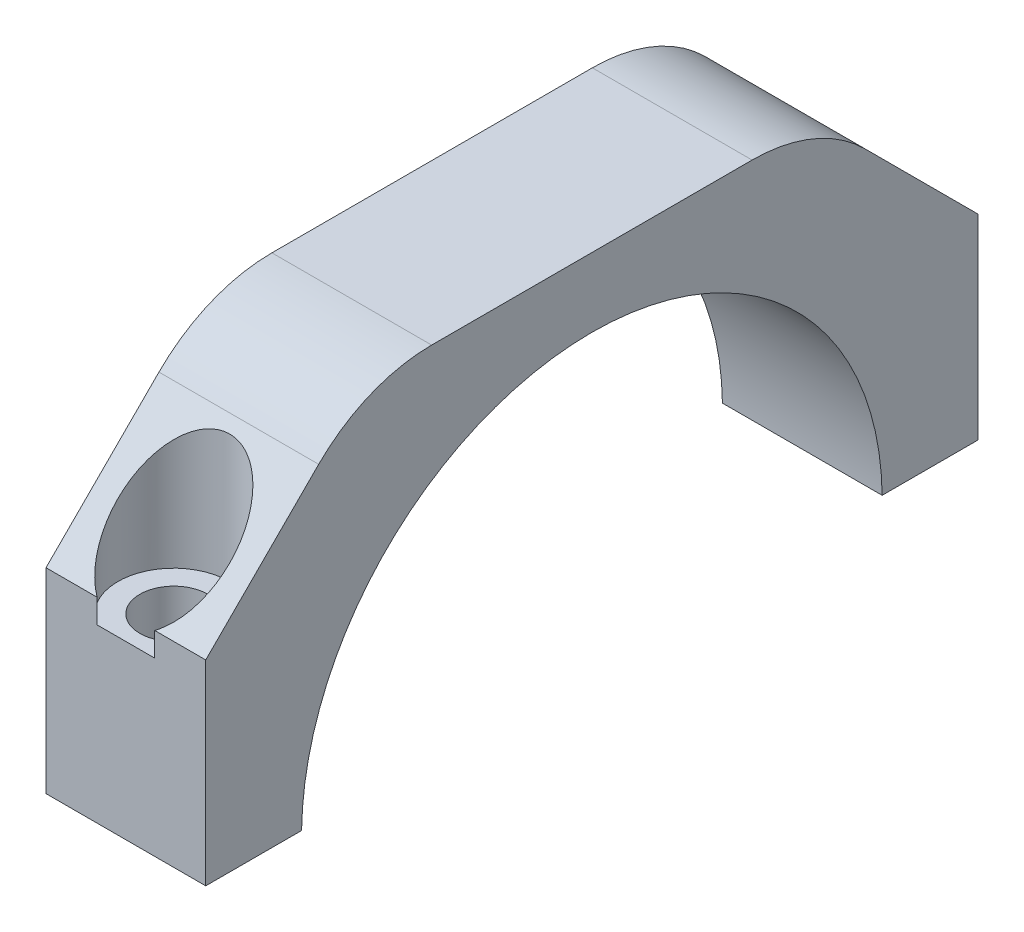
ISO-10303-21;
HEADER;
FILE_DESCRIPTION(('STEP AP214'),'2;1');
FILE_NAME('part.step','',(''),(''),'','','');
FILE_SCHEMA(('AUTOMOTIVE_DESIGN { 1 0 10303 214 1 1 1 1 }'));
ENDSEC;
DATA;
#1=APPLICATION_CONTEXT('core data for automotive mechanical design processes');
#2=APPLICATION_PROTOCOL_DEFINITION('international standard','automotive_design',2000,#1);
#3=PRODUCT_CONTEXT('',#1,'mechanical');
#4=PRODUCT('Part','Part','',(#3));
#5=PRODUCT_RELATED_PRODUCT_CATEGORY('part','',(#4));
#6=PRODUCT_DEFINITION_FORMATION('','',#4);
#7=PRODUCT_DEFINITION_CONTEXT('part definition',#1,'design');
#8=PRODUCT_DEFINITION('design','',#6,#7);
#9=PRODUCT_DEFINITION_SHAPE('','',#8);
#10=(LENGTH_UNIT() NAMED_UNIT(*) SI_UNIT(.MILLI.,.METRE.));
#11=(NAMED_UNIT(*) PLANE_ANGLE_UNIT() SI_UNIT($,.RADIAN.));
#12=(NAMED_UNIT(*) SI_UNIT($,.STERADIAN.) SOLID_ANGLE_UNIT());
#13=UNCERTAINTY_MEASURE_WITH_UNIT(LENGTH_MEASURE(1.E-05),#10,'distance_accuracy_value','');
#14=(GEOMETRIC_REPRESENTATION_CONTEXT(3) GLOBAL_UNCERTAINTY_ASSIGNED_CONTEXT((#13)) GLOBAL_UNIT_ASSIGNED_CONTEXT((#10,
#11,#12)) REPRESENTATION_CONTEXT('',''));
#15=CARTESIAN_POINT('',(0.,0.,0.));
#16=DIRECTION('',(0.,0.,1.));
#17=DIRECTION('',(1.,0.,0.));
#18=AXIS2_PLACEMENT_3D('',#15,#16,#17);
#19=CARTESIAN_POINT('',(10.,-44.5000000000001,-42.3465610477801));
#20=DIRECTION('',(0.,-1.,0.));
#21=DIRECTION('',(0.,0.,-1.));
#22=AXIS2_PLACEMENT_3D('',#19,#20,#21);
#23=CYLINDRICAL_SURFACE('',#22,4.24999999999999);
#24=CARTESIAN_POINT('',(10.,-44.5000000000001,-42.3465610477801));
#25=DIRECTION('',(0.,-1.,0.));
#26=DIRECTION('',(0.,0.,-1.));
#27=AXIS2_PLACEMENT_3D('',#24,#25,#26);
#28=CIRCLE('',#27,4.24999999999999);
#29=CARTESIAN_POINT('',(10.,-44.5000000000001,-46.59656104778));
#30=VERTEX_POINT('',#29);
#31=EDGE_CURVE('E199',#30,#30,#28,.T.);
#32=ORIENTED_EDGE('',*,*,#31,.T.);
#33=EDGE_LOOP('',(#32));
#34=FACE_BOUND('',#33,.T.);
#35=CARTESIAN_POINT('',(10.,-23.,-42.3465610477801));
#36=DIRECTION('',(0.,1.,0.));
#37=DIRECTION('',(0.,0.,1.));
#38=AXIS2_PLACEMENT_3D('',#35,#36,#37);
#39=CIRCLE('',#38,4.24999999999999);
#40=CARTESIAN_POINT('',(10.,-23.,-38.0965610477801));
#41=VERTEX_POINT('',#40);
#42=EDGE_CURVE('E173',#41,#41,#39,.F.);
#43=ORIENTED_EDGE('',*,*,#42,.F.);
#44=EDGE_LOOP('',(#43));
#45=FACE_BOUND('',#44,.T.);
#46=ADVANCED_FACE('F44',(#34,#45),#23,.F.);
#47=CARTESIAN_POINT('',(10.,-44.5,42.3465610477801));
#48=DIRECTION('',(0.,-1.,0.));
#49=DIRECTION('',(0.,0.,-1.));
#50=AXIS2_PLACEMENT_3D('',#47,#48,#49);
#51=CYLINDRICAL_SURFACE('',#50,4.24999999999999);
#52=CARTESIAN_POINT('',(10.,-44.5,42.3465610477801));
#53=DIRECTION('',(0.,-1.,0.));
#54=DIRECTION('',(0.,0.,-1.));
#55=AXIS2_PLACEMENT_3D('',#52,#53,#54);
#56=CIRCLE('',#55,4.24999999999999);
#57=CARTESIAN_POINT('',(10.,-44.5,38.0965610477801));
#58=VERTEX_POINT('',#57);
#59=EDGE_CURVE('E196',#58,#58,#56,.T.);
#60=ORIENTED_EDGE('',*,*,#59,.T.);
#61=EDGE_LOOP('',(#60));
#62=FACE_BOUND('',#61,.T.);
#63=CARTESIAN_POINT('',(10.,-23.,42.3465610477801));
#64=DIRECTION('',(0.,1.,0.));
#65=DIRECTION('',(0.,0.,1.));
#66=AXIS2_PLACEMENT_3D('',#63,#64,#65);
#67=CIRCLE('',#66,4.24999999999999);
#68=CARTESIAN_POINT('',(10.,-23.,46.59656104778));
#69=VERTEX_POINT('',#68);
#70=EDGE_CURVE('E187',#69,#69,#67,.F.);
#71=ORIENTED_EDGE('',*,*,#70,.F.);
#72=EDGE_LOOP('',(#71));
#73=FACE_BOUND('',#72,.T.);
#74=ADVANCED_FACE('F344',(#62,#73),#51,.F.);
#75=CARTESIAN_POINT('',(20.,0.,48.3465610477801));
#76=DIRECTION('',(0.,0.,-1.));
#77=DIRECTION('',(0.,1.,0.));
#78=AXIS2_PLACEMENT_3D('',#75,#76,#77);
#79=PLANE('',#78);
#80=DIRECTION('',(1.,0.,0.));
#81=VECTOR('',#80,1.);
#82=CARTESIAN_POINT('',(20.,-23.,48.3465610477801));
#83=LINE('',#82,#81);
#84=CARTESIAN_POINT('',(6.394448724536,-23.,48.3465610477801));
#85=VERTEX_POINT('',#84);
#86=CARTESIAN_POINT('',(13.605551275464,-23.,48.3465610477801));
#87=VERTEX_POINT('',#86);
#88=EDGE_CURVE('E188',#85,#87,#83,.T.);
#89=ORIENTED_EDGE('',*,*,#88,.F.);
#90=DIRECTION('',(0.,1.,0.));
#91=VECTOR('',#90,1.);
#92=CARTESIAN_POINT('',(6.394448724536,-23.,48.3465610477801));
#93=LINE('',#92,#91);
#94=CARTESIAN_POINT('',(6.394448724536,-20.,48.3465610477801));
#95=VERTEX_POINT('',#94);
#96=EDGE_CURVE('E193',#85,#95,#93,.T.);
#97=ORIENTED_EDGE('',*,*,#96,.T.);
#98=DIRECTION('',(-1.,0.,0.));
#99=VECTOR('',#98,1.);
#100=CARTESIAN_POINT('',(20.,-20.,48.3465610477801));
#101=LINE('',#100,#99);
#102=CARTESIAN_POINT('',(0.,-20.,48.3465610477801));
#103=VERTEX_POINT('',#102);
#104=EDGE_CURVE('E265',#95,#103,#101,.T.);
#105=ORIENTED_EDGE('',*,*,#104,.T.);
#106=DIRECTION('',(0.,-1.,0.));
#107=VECTOR('',#106,1.);
#108=CARTESIAN_POINT('',(0.,0.,48.3465610477801));
#109=LINE('',#108,#107);
#110=CARTESIAN_POINT('',(0.,-44.5,48.3465610477801));
#111=VERTEX_POINT('',#110);
#112=EDGE_CURVE('E203',#103,#111,#109,.T.);
#113=ORIENTED_EDGE('',*,*,#112,.T.);
#114=DIRECTION('',(-1.,0.,0.));
#115=VECTOR('',#114,1.);
#116=CARTESIAN_POINT('',(20.,-44.5,48.3465610477801));
#117=LINE('',#116,#115);
#118=CARTESIAN_POINT('',(20.,-44.5,48.3465610477801));
#119=VERTEX_POINT('',#118);
#120=EDGE_CURVE('E248',#119,#111,#117,.T.);
#121=ORIENTED_EDGE('',*,*,#120,.F.);
#122=DIRECTION('',(0.,-1.,0.));
#123=VECTOR('',#122,1.);
#124=CARTESIAN_POINT('',(20.,0.,48.3465610477801));
#125=LINE('',#124,#123);
#126=CARTESIAN_POINT('',(20.,-20.,48.3465610477801));
#127=VERTEX_POINT('',#126);
#128=EDGE_CURVE('E204',#127,#119,#125,.T.);
#129=ORIENTED_EDGE('',*,*,#128,.F.);
#130=CARTESIAN_POINT('',(13.605551275464,-20.,48.3465610477801));
#131=VERTEX_POINT('',#130);
#132=EDGE_CURVE('E266',#127,#131,#101,.T.);
#133=ORIENTED_EDGE('',*,*,#132,.T.);
#134=DIRECTION('',(0.,1.,0.));
#135=VECTOR('',#134,1.);
#136=CARTESIAN_POINT('',(13.605551275464,-23.,48.3465610477801));
#137=LINE('',#136,#135);
#138=EDGE_CURVE('E190',#131,#87,#137,.F.);
#139=ORIENTED_EDGE('',*,*,#138,.T.);
#140=EDGE_LOOP('',(#89,#97,#105,#113,#121,#129,#133,#139));
#141=FACE_BOUND('',#140,.T.);
#142=ADVANCED_FACE('F330',(#141),#79,.F.);
#143=CARTESIAN_POINT('',(20.,-44.5,48.3465610477801));
#144=DIRECTION('',(0.,1.,0.));
#145=DIRECTION('',(0.,0.,1.));
#146=AXIS2_PLACEMENT_3D('',#143,#144,#145);
#147=PLANE('',#146);
#148=ORIENTED_EDGE('',*,*,#59,.F.);
#149=EDGE_LOOP('',(#148));
#150=FACE_BOUND('',#149,.T.);
#151=DIRECTION('',(0.,0.,-1.));
#152=VECTOR('',#151,1.);
#153=CARTESIAN_POINT('',(0.,-44.5,48.3465610477801));
#154=LINE('',#153,#152);
#155=CARTESIAN_POINT('',(0.,-44.5,36.3465610477801));
#156=VERTEX_POINT('',#155);
#157=EDGE_CURVE('E224',#111,#156,#154,.T.);
#158=ORIENTED_EDGE('',*,*,#157,.T.);
#159=DIRECTION('',(-1.,0.,0.));
#160=VECTOR('',#159,1.);
#161=CARTESIAN_POINT('',(20.,-44.5,36.3465610477801));
#162=LINE('',#161,#160);
#163=CARTESIAN_POINT('',(20.,-44.5,36.3465610477801));
#164=VERTEX_POINT('',#163);
#165=EDGE_CURVE('E245',#164,#156,#162,.T.);
#166=ORIENTED_EDGE('',*,*,#165,.F.);
#167=DIRECTION('',(0.,0.,-1.));
#168=VECTOR('',#167,1.);
#169=CARTESIAN_POINT('',(20.,-44.5,48.3465610477801));
#170=LINE('',#169,#168);
#171=EDGE_CURVE('E206',#119,#164,#170,.T.);
#172=ORIENTED_EDGE('',*,*,#171,.F.);
#173=ORIENTED_EDGE('',*,*,#120,.T.);
#174=EDGE_LOOP('',(#158,#166,#172,#173));
#175=FACE_BOUND('',#174,.T.);
#176=ADVANCED_FACE('F323',(#150,#175),#147,.F.);
#177=CARTESIAN_POINT('',(20.,-44.9999999999978,0.));
#178=DIRECTION('',(-1.,0.,0.));
#179=DIRECTION('',(0.,0.,1.));
#180=AXIS2_PLACEMENT_3D('',#177,#178,#179);
#181=CYLINDRICAL_SURFACE('',#180,36.35);
#182=CARTESIAN_POINT('',(0.,-44.9999999999978,0.));
#183=DIRECTION('',(-1.,0.,0.));
#184=DIRECTION('',(0.,0.,-1.));
#185=AXIS2_PLACEMENT_3D('',#182,#183,#184);
#186=CIRCLE('',#185,36.35);
#187=CARTESIAN_POINT('',(0.,-44.5,-36.3465610477801));
#188=VERTEX_POINT('',#187);
#189=EDGE_CURVE('E226',#156,#188,#186,.T.);
#190=ORIENTED_EDGE('',*,*,#189,.T.);
#191=DIRECTION('',(-1.,0.,0.));
#192=VECTOR('',#191,1.);
#193=CARTESIAN_POINT('',(20.,-44.5,-36.3465610477801));
#194=LINE('',#193,#192);
#195=CARTESIAN_POINT('',(20.,-44.5,-36.3465610477801));
#196=VERTEX_POINT('',#195);
#197=EDGE_CURVE('E241',#196,#188,#194,.T.);
#198=ORIENTED_EDGE('',*,*,#197,.F.);
#199=CARTESIAN_POINT('',(20.,-44.9999999999978,0.));
#200=DIRECTION('',(-1.,0.,0.));
#201=DIRECTION('',(0.,0.,-1.));
#202=AXIS2_PLACEMENT_3D('',#199,#200,#201);
#203=CIRCLE('',#202,36.35);
#204=EDGE_CURVE('E209',#164,#196,#203,.T.);
#205=ORIENTED_EDGE('',*,*,#204,.F.);
#206=ORIENTED_EDGE('',*,*,#165,.T.);
#207=EDGE_LOOP('',(#190,#198,#205,#206));
#208=FACE_BOUND('',#207,.T.);
#209=ADVANCED_FACE('F319',(#208),#181,.F.);
#210=CARTESIAN_POINT('',(20.,-44.5,-48.3465610477801));
#211=DIRECTION('',(0.,1.,0.));
#212=DIRECTION('',(0.,0.,1.));
#213=AXIS2_PLACEMENT_3D('',#210,#211,#212);
#214=PLANE('',#213);
#215=ORIENTED_EDGE('',*,*,#31,.F.);
#216=EDGE_LOOP('',(#215));
#217=FACE_BOUND('',#216,.T.);
#218=DIRECTION('',(0.,0.,-1.));
#219=VECTOR('',#218,1.);
#220=CARTESIAN_POINT('',(0.,-44.5,-48.3465610477801));
#221=LINE('',#220,#219);
#222=CARTESIAN_POINT('',(0.,-44.5,-48.3465610477801));
#223=VERTEX_POINT('',#222);
#224=EDGE_CURVE('E229',#188,#223,#221,.T.);
#225=ORIENTED_EDGE('',*,*,#224,.T.);
#226=DIRECTION('',(-1.,0.,0.));
#227=VECTOR('',#226,1.);
#228=CARTESIAN_POINT('',(20.,-44.5,-48.3465610477801));
#229=LINE('',#228,#227);
#230=CARTESIAN_POINT('',(20.,-44.5,-48.3465610477801));
#231=VERTEX_POINT('',#230);
#232=EDGE_CURVE('E222',#231,#223,#229,.T.);
#233=ORIENTED_EDGE('',*,*,#232,.F.);
#234=DIRECTION('',(0.,0.,-1.));
#235=VECTOR('',#234,1.);
#236=CARTESIAN_POINT('',(20.,-44.5,-48.3465610477801));
#237=LINE('',#236,#235);
#238=EDGE_CURVE('E212',#196,#231,#237,.T.);
#239=ORIENTED_EDGE('',*,*,#238,.F.);
#240=ORIENTED_EDGE('',*,*,#197,.T.);
#241=EDGE_LOOP('',(#225,#233,#239,#240));
#242=FACE_BOUND('',#241,.T.);
#243=ADVANCED_FACE('F314',(#217,#242),#214,.F.);
#244=CARTESIAN_POINT('',(20.,0.,-48.3465610477801));
#245=DIRECTION('',(0.,0.,1.));
#246=DIRECTION('',(0.,-1.,0.));
#247=AXIS2_PLACEMENT_3D('',#244,#245,#246);
#248=PLANE('',#247);
#249=DIRECTION('',(-1.,0.,0.));
#250=VECTOR('',#249,1.);
#251=CARTESIAN_POINT('',(20.,-23.,-48.3465610477801));
#252=LINE('',#251,#250);
#253=CARTESIAN_POINT('',(13.605551275464,-23.,-48.3465610477801));
#254=VERTEX_POINT('',#253);
#255=CARTESIAN_POINT('',(6.39444872453602,-23.,-48.3465610477801));
#256=VERTEX_POINT('',#255);
#257=EDGE_CURVE('E171',#254,#256,#252,.T.);
#258=ORIENTED_EDGE('',*,*,#257,.F.);
#259=DIRECTION('',(0.,1.,0.));
#260=VECTOR('',#259,1.);
#261=CARTESIAN_POINT('',(13.605551275464,-23.,-48.3465610477801));
#262=LINE('',#261,#260);
#263=CARTESIAN_POINT('',(13.605551275464,-20.0000000000001,-48.3465610477801));
#264=VERTEX_POINT('',#263);
#265=EDGE_CURVE('E155',#254,#264,#262,.T.);
#266=ORIENTED_EDGE('',*,*,#265,.T.);
#267=DIRECTION('',(1.,0.,0.));
#268=VECTOR('',#267,1.);
#269=CARTESIAN_POINT('',(20.,-20.0000000000001,-48.3465610477801));
#270=LINE('',#269,#268);
#271=CARTESIAN_POINT('',(20.,-20.0000000000001,-48.3465610477801));
#272=VERTEX_POINT('',#271);
#273=EDGE_CURVE('E256',#264,#272,#270,.T.);
#274=ORIENTED_EDGE('',*,*,#273,.T.);
#275=DIRECTION('',(0.,1.,0.));
#276=VECTOR('',#275,1.);
#277=CARTESIAN_POINT('',(20.,0.,-48.3465610477801));
#278=LINE('',#277,#276);
#279=EDGE_CURVE('E215',#231,#272,#278,.T.);
#280=ORIENTED_EDGE('',*,*,#279,.F.);
#281=ORIENTED_EDGE('',*,*,#232,.T.);
#282=DIRECTION('',(0.,1.,0.));
#283=VECTOR('',#282,1.);
#284=CARTESIAN_POINT('',(0.,0.,-48.3465610477801));
#285=LINE('',#284,#283);
#286=CARTESIAN_POINT('',(0.,-20.0000000000001,-48.3465610477801));
#287=VERTEX_POINT('',#286);
#288=EDGE_CURVE('E232',#223,#287,#285,.T.);
#289=ORIENTED_EDGE('',*,*,#288,.T.);
#290=CARTESIAN_POINT('',(6.394448724536,-20.0000000000001,-48.3465610477801));
#291=VERTEX_POINT('',#290);
#292=EDGE_CURVE('E257',#287,#291,#270,.T.);
#293=ORIENTED_EDGE('',*,*,#292,.T.);
#294=DIRECTION('',(0.,1.,0.));
#295=VECTOR('',#294,1.);
#296=CARTESIAN_POINT('',(6.39444872453602,-23.,-48.3465610477801));
#297=LINE('',#296,#295);
#298=EDGE_CURVE('E167',#291,#256,#297,.F.);
#299=ORIENTED_EDGE('',*,*,#298,.T.);
#300=EDGE_LOOP('',(#258,#266,#274,#280,#281,#289,#293,#299));
#301=FACE_BOUND('',#300,.T.);
#302=ADVANCED_FACE('F175',(#301),#248,.F.);
#303=CARTESIAN_POINT('',(20.,0.,48.3465610477801));
#304=DIRECTION('',(0.,-1.,0.));
#305=DIRECTION('',(0.,0.,-1.));
#306=AXIS2_PLACEMENT_3D('',#303,#304,#305);
#307=PLANE('',#306);
#308=DIRECTION('',(0.,0.,1.));
#309=VECTOR('',#308,1.);
#310=CARTESIAN_POINT('',(20.,0.,48.3465610477801));
#311=LINE('',#310,#309);
#312=CARTESIAN_POINT('',(20.,0.,-20.0622898003181));
#313=VERTEX_POINT('',#312);
#314=CARTESIAN_POINT('',(20.,0.,20.0622898003181));
#315=VERTEX_POINT('',#314);
#316=EDGE_CURVE('E219',#313,#315,#311,.T.);
#317=ORIENTED_EDGE('',*,*,#316,.F.);
#318=DIRECTION('',(1.,0.,0.));
#319=VECTOR('',#318,1.);
#320=CARTESIAN_POINT('',(0.,0.,-20.0622898003181));
#321=LINE('',#320,#319);
#322=CARTESIAN_POINT('',(0.,0.,-20.0622898003181));
#323=VERTEX_POINT('',#322);
#324=EDGE_CURVE('E281',#313,#323,#321,.F.);
#325=ORIENTED_EDGE('',*,*,#324,.T.);
#326=DIRECTION('',(0.,0.,1.));
#327=VECTOR('',#326,1.);
#328=CARTESIAN_POINT('',(0.,0.,48.3465610477801));
#329=LINE('',#328,#327);
#330=CARTESIAN_POINT('',(0.,0.,20.0622898003181));
#331=VERTEX_POINT('',#330);
#332=EDGE_CURVE('E207',#323,#331,#329,.T.);
#333=ORIENTED_EDGE('',*,*,#332,.T.);
#334=DIRECTION('',(-1.,0.,0.));
#335=VECTOR('',#334,1.);
#336=CARTESIAN_POINT('',(20.,0.,20.0622898003181));
#337=LINE('',#336,#335);
#338=EDGE_CURVE('E277',#331,#315,#337,.F.);
#339=ORIENTED_EDGE('',*,*,#338,.T.);
#340=EDGE_LOOP('',(#317,#325,#333,#339));
#341=FACE_BOUND('',#340,.T.);
#342=ADVANCED_FACE('F299',(#341),#307,.F.);
#343=CARTESIAN_POINT('',(20.,-44.9999999999978,0.));
#344=DIRECTION('',(1.,0.,0.));
#345=DIRECTION('',(0.,0.,-1.));
#346=AXIS2_PLACEMENT_3D('',#343,#344,#345);
#347=PLANE('',#346);
#348=DIRECTION('',(0.,-0.707106781186549,-0.707106781186546));
#349=VECTOR('',#348,1.);
#350=CARTESIAN_POINT('',(20.,-8.32671947610894,-36.6732805238889));
#351=LINE('',#350,#349);
#352=CARTESIAN_POINT('',(20.,-5.85786437626906,-34.2044254240491));
#353=VERTEX_POINT('',#352);
#354=EDGE_CURVE('E262',#272,#353,#351,.F.);
#355=ORIENTED_EDGE('',*,*,#354,.T.);
#356=CARTESIAN_POINT('',(20.,-20.,-20.0622898003181));
#357=DIRECTION('',(1.,0.,0.));
#358=DIRECTION('',(0.,0.,-1.));
#359=AXIS2_PLACEMENT_3D('',#356,#357,#358);
#360=CIRCLE('',#359,20.);
#361=EDGE_CURVE('E52',#353,#313,#360,.T.);
#362=ORIENTED_EDGE('',*,*,#361,.T.);
#363=ORIENTED_EDGE('',*,*,#316,.T.);
#364=CARTESIAN_POINT('',(20.,-20.,20.0622898003181));
#365=DIRECTION('',(1.,0.,0.));
#366=DIRECTION('',(0.,0.,-1.));
#367=AXIS2_PLACEMENT_3D('',#364,#365,#366);
#368=CIRCLE('',#367,20.);
#369=CARTESIAN_POINT('',(20.,-5.85786437626902,34.204425424049));
#370=VERTEX_POINT('',#369);
#371=EDGE_CURVE('E59',#315,#370,#368,.T.);
#372=ORIENTED_EDGE('',*,*,#371,.T.);
#373=DIRECTION('',(0.,0.707106781186546,-0.707106781186549));
#374=VECTOR('',#373,1.);
#375=CARTESIAN_POINT('',(20.,-8.32671947610881,36.6732805238888));
#376=LINE('',#375,#374);
#377=EDGE_CURVE('E259',#370,#127,#376,.F.);
#378=ORIENTED_EDGE('',*,*,#377,.T.);
#379=ORIENTED_EDGE('',*,*,#128,.T.);
#380=ORIENTED_EDGE('',*,*,#171,.T.);
#381=ORIENTED_EDGE('',*,*,#204,.T.);
#382=ORIENTED_EDGE('',*,*,#238,.T.);
#383=ORIENTED_EDGE('',*,*,#279,.T.);
#384=EDGE_LOOP('',(#355,#362,#363,#372,#378,#379,#380,#381,#382,#383));
#385=FACE_BOUND('',#384,.T.);
#386=ADVANCED_FACE('F295',(#385),#347,.T.);
#387=CARTESIAN_POINT('',(0.,-44.9999999999978,0.));
#388=DIRECTION('',(1.,0.,0.));
#389=DIRECTION('',(0.,0.,-1.));
#390=AXIS2_PLACEMENT_3D('',#387,#388,#389);
#391=PLANE('',#390);
#392=ORIENTED_EDGE('',*,*,#332,.F.);
#393=CARTESIAN_POINT('',(0.,-20.,-20.0622898003181));
#394=DIRECTION('',(1.,0.,0.));
#395=DIRECTION('',(0.,0.,-1.));
#396=AXIS2_PLACEMENT_3D('',#393,#394,#395);
#397=CIRCLE('',#396,20.);
#398=CARTESIAN_POINT('',(0.,-5.85786437626907,-34.2044254240491));
#399=VERTEX_POINT('',#398);
#400=EDGE_CURVE('E287',#323,#399,#397,.F.);
#401=ORIENTED_EDGE('',*,*,#400,.T.);
#402=DIRECTION('',(0.,0.707106781186549,0.707106781186546));
#403=VECTOR('',#402,1.);
#404=CARTESIAN_POINT('',(0.,0.,-28.34656104778));
#405=LINE('',#404,#403);
#406=EDGE_CURVE('E254',#399,#287,#405,.F.);
#407=ORIENTED_EDGE('',*,*,#406,.T.);
#408=ORIENTED_EDGE('',*,*,#288,.F.);
#409=ORIENTED_EDGE('',*,*,#224,.F.);
#410=ORIENTED_EDGE('',*,*,#189,.F.);
#411=ORIENTED_EDGE('',*,*,#157,.F.);
#412=ORIENTED_EDGE('',*,*,#112,.F.);
#413=DIRECTION('',(0.,-0.707106781186546,0.707106781186549));
#414=VECTOR('',#413,1.);
#415=CARTESIAN_POINT('',(0.,-20.,48.3465610477801));
#416=LINE('',#415,#414);
#417=CARTESIAN_POINT('',(0.,-5.85786437626902,34.204425424049));
#418=VERTEX_POINT('',#417);
#419=EDGE_CURVE('E251',#103,#418,#416,.F.);
#420=ORIENTED_EDGE('',*,*,#419,.T.);
#421=CARTESIAN_POINT('',(0.,-20.,20.0622898003181));
#422=DIRECTION('',(1.,0.,0.));
#423=DIRECTION('',(0.,0.,-1.));
#424=AXIS2_PLACEMENT_3D('',#421,#422,#423);
#425=CIRCLE('',#424,20.);
#426=EDGE_CURVE('E285',#418,#331,#425,.F.);
#427=ORIENTED_EDGE('',*,*,#426,.T.);
#428=EDGE_LOOP('',(#392,#401,#407,#408,#409,#410,#411,#412,#420,#427));
#429=FACE_BOUND('',#428,.T.);
#430=ADVANCED_FACE('F304',(#429),#391,.F.);
#431=CARTESIAN_POINT('',(20.,0.,-28.34656104778));
#432=DIRECTION('',(0.,-0.707106781186546,0.707106781186549));
#433=DIRECTION('',(-1.,0.,0.));
#434=AXIS2_PLACEMENT_3D('',#431,#432,#433);
#435=PLANE('',#434);
#436=ORIENTED_EDGE('',*,*,#406,.F.);
#437=DIRECTION('',(-1.,0.,0.));
#438=VECTOR('',#437,1.);
#439=CARTESIAN_POINT('',(20.,-5.85786437626906,-34.2044254240491));
#440=LINE('',#439,#438);
#441=EDGE_CURVE('E70',#399,#353,#440,.F.);
#442=ORIENTED_EDGE('',*,*,#441,.T.);
#443=ORIENTED_EDGE('',*,*,#354,.F.);
#444=ORIENTED_EDGE('',*,*,#273,.F.);
#445=CARTESIAN_POINT('',(10.,-14.0000000000001,-42.3465610477801));
#446=DIRECTION('',(0.,-0.707106781186546,0.707106781186549));
#447=DIRECTION('',(0.,0.707106781186549,0.707106781186546));
#448=AXIS2_PLACEMENT_3D('',#445,#446,#447);
#449=ELLIPSE('',#448,9.89949493661168,7.);
#450=EDGE_CURVE('E161',#291,#264,#449,.F.);
#451=ORIENTED_EDGE('',*,*,#450,.F.);
#452=ORIENTED_EDGE('',*,*,#292,.F.);
#453=EDGE_LOOP('',(#436,#442,#443,#444,#451,#452));
#454=FACE_BOUND('',#453,.T.);
#455=ADVANCED_FACE('F307',(#454),#435,.F.);
#456=CARTESIAN_POINT('',(20.,-20.,48.3465610477801));
#457=DIRECTION('',(0.,-0.707106781186549,-0.707106781186546));
#458=DIRECTION('',(-1.,0.,0.));
#459=AXIS2_PLACEMENT_3D('',#456,#457,#458);
#460=PLANE('',#459);
#461=ORIENTED_EDGE('',*,*,#377,.F.);
#462=DIRECTION('',(1.,0.,0.));
#463=VECTOR('',#462,1.);
#464=CARTESIAN_POINT('',(0.,-5.85786437626902,34.204425424049));
#465=LINE('',#464,#463);
#466=EDGE_CURVE('E11',#370,#418,#465,.F.);
#467=ORIENTED_EDGE('',*,*,#466,.T.);
#468=ORIENTED_EDGE('',*,*,#419,.F.);
#469=ORIENTED_EDGE('',*,*,#104,.F.);
#470=CARTESIAN_POINT('',(10.,-14.,42.3465610477801));
#471=DIRECTION('',(0.,-0.707106781186549,-0.707106781186546));
#472=DIRECTION('',(0.,0.707106781186546,-0.707106781186549));
#473=AXIS2_PLACEMENT_3D('',#470,#471,#472);
#474=ELLIPSE('',#473,9.89949493661165,7.);
#475=EDGE_CURVE('E269',#131,#95,#474,.F.);
#476=ORIENTED_EDGE('',*,*,#475,.F.);
#477=ORIENTED_EDGE('',*,*,#132,.F.);
#478=EDGE_LOOP('',(#461,#467,#468,#469,#476,#477));
#479=FACE_BOUND('',#478,.T.);
#480=ADVANCED_FACE('F335',(#479),#460,.F.);
#481=CARTESIAN_POINT('',(10.,-23.,42.3465610477801));
#482=DIRECTION('',(0.,1.,0.));
#483=DIRECTION('',(0.,0.,1.));
#484=AXIS2_PLACEMENT_3D('',#481,#482,#483);
#485=CYLINDRICAL_SURFACE('',#484,7.);
#486=CARTESIAN_POINT('',(10.,-23.,42.3465610477801));
#487=DIRECTION('',(0.,1.,0.));
#488=DIRECTION('',(0.,0.,1.));
#489=AXIS2_PLACEMENT_3D('',#486,#487,#488);
#490=CIRCLE('',#489,7.);
#491=EDGE_CURVE('E166',#87,#85,#490,.T.);
#492=ORIENTED_EDGE('',*,*,#491,.F.);
#493=ORIENTED_EDGE('',*,*,#138,.F.);
#494=ORIENTED_EDGE('',*,*,#475,.T.);
#495=ORIENTED_EDGE('',*,*,#96,.F.);
#496=EDGE_LOOP('',(#492,#493,#494,#495));
#497=FACE_BOUND('',#496,.T.);
#498=ADVANCED_FACE('F376',(#497),#485,.F.);
#499=CARTESIAN_POINT('',(10.,-23.,42.3465610477801));
#500=DIRECTION('',(0.,1.,0.));
#501=DIRECTION('',(0.,0.,1.));
#502=AXIS2_PLACEMENT_3D('',#499,#500,#501);
#503=PLANE('',#502);
#504=ORIENTED_EDGE('',*,*,#70,.T.);
#505=EDGE_LOOP('',(#504));
#506=FACE_BOUND('',#505,.T.);
#507=ORIENTED_EDGE('',*,*,#88,.T.);
#508=ORIENTED_EDGE('',*,*,#491,.T.);
#509=EDGE_LOOP('',(#507,#508));
#510=FACE_BOUND('',#509,.T.);
#511=ADVANCED_FACE('F380',(#506,#510),#503,.T.);
#512=CARTESIAN_POINT('',(10.,-23.,-42.3465610477801));
#513=DIRECTION('',(0.,1.,0.));
#514=DIRECTION('',(0.,0.,1.));
#515=AXIS2_PLACEMENT_3D('',#512,#513,#514);
#516=CYLINDRICAL_SURFACE('',#515,7.);
#517=CARTESIAN_POINT('',(10.,-23.,-42.3465610477801));
#518=DIRECTION('',(0.,1.,0.));
#519=DIRECTION('',(0.,0.,1.));
#520=AXIS2_PLACEMENT_3D('',#517,#518,#519);
#521=CIRCLE('',#520,7.);
#522=EDGE_CURVE('E158',#256,#254,#521,.T.);
#523=ORIENTED_EDGE('',*,*,#522,.F.);
#524=ORIENTED_EDGE('',*,*,#298,.F.);
#525=ORIENTED_EDGE('',*,*,#450,.T.);
#526=ORIENTED_EDGE('',*,*,#265,.F.);
#527=EDGE_LOOP('',(#523,#524,#525,#526));
#528=FACE_BOUND('',#527,.T.);
#529=ADVANCED_FACE('F157',(#528),#516,.F.);
#530=CARTESIAN_POINT('',(10.,-23.,-42.3465610477801));
#531=DIRECTION('',(0.,1.,0.));
#532=DIRECTION('',(0.,0.,1.));
#533=AXIS2_PLACEMENT_3D('',#530,#531,#532);
#534=PLANE('',#533);
#535=ORIENTED_EDGE('',*,*,#42,.T.);
#536=EDGE_LOOP('',(#535));
#537=FACE_BOUND('',#536,.T.);
#538=ORIENTED_EDGE('',*,*,#257,.T.);
#539=ORIENTED_EDGE('',*,*,#522,.T.);
#540=EDGE_LOOP('',(#538,#539));
#541=FACE_BOUND('',#540,.T.);
#542=ADVANCED_FACE('F170',(#537,#541),#534,.T.);
#543=CARTESIAN_POINT('',(20.,-20.,-20.0622898003181));
#544=DIRECTION('',(-1.,0.,0.));
#545=DIRECTION('',(0.,0.,1.));
#546=AXIS2_PLACEMENT_3D('',#543,#544,#545);
#547=CYLINDRICAL_SURFACE('',#546,20.);
#548=ORIENTED_EDGE('',*,*,#361,.F.);
#549=ORIENTED_EDGE('',*,*,#441,.F.);
#550=ORIENTED_EDGE('',*,*,#400,.F.);
#551=ORIENTED_EDGE('',*,*,#324,.F.);
#552=EDGE_LOOP('',(#548,#549,#550,#551));
#553=FACE_BOUND('',#552,.T.);
#554=ADVANCED_FACE('F302',(#553),#547,.T.);
#555=CARTESIAN_POINT('',(20.,-20.,20.0622898003181));
#556=DIRECTION('',(1.,0.,0.));
#557=DIRECTION('',(0.,0.,-1.));
#558=AXIS2_PLACEMENT_3D('',#555,#556,#557);
#559=CYLINDRICAL_SURFACE('',#558,20.);
#560=ORIENTED_EDGE('',*,*,#426,.F.);
#561=ORIENTED_EDGE('',*,*,#466,.F.);
#562=ORIENTED_EDGE('',*,*,#371,.F.);
#563=ORIENTED_EDGE('',*,*,#338,.F.);
#564=EDGE_LOOP('',(#560,#561,#562,#563));
#565=FACE_BOUND('',#564,.T.);
#566=ADVANCED_FACE('F46',(#565),#559,.T.);
#567=CLOSED_SHELL('',(#46,#74,#142,#176,#209,#243,#302,#342,#386,#430,#455,#480,#498,#511,#529,
#542,#554,#566));
#568=MANIFOLD_SOLID_BREP('B2',#567);
#569=ADVANCED_BREP_SHAPE_REPRESENTATION('',(#18,#568),#14);
#570=SHAPE_DEFINITION_REPRESENTATION(#9,#569);
ENDSEC;
END-ISO-10303-21;
